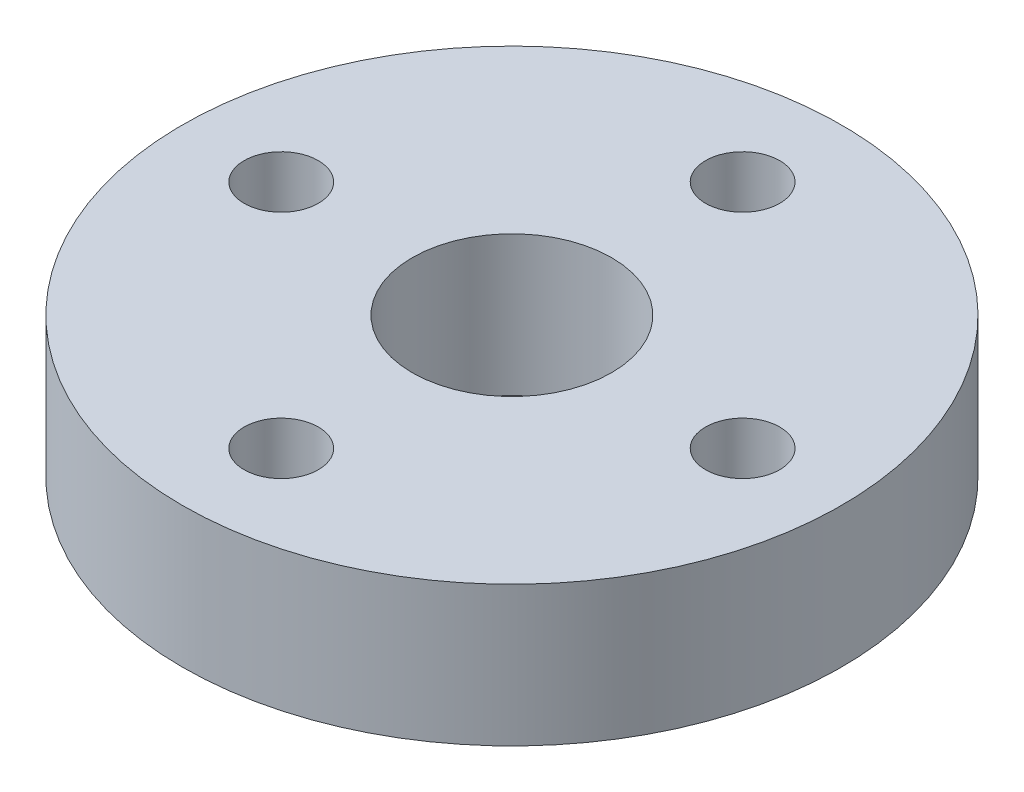
ISO-10303-21;
HEADER;
FILE_DESCRIPTION(('STEP AP214'),'2;1');
FILE_NAME('part.step','',(''),(''),'','','');
FILE_SCHEMA(('AUTOMOTIVE_DESIGN { 1 0 10303 214 1 1 1 1 }'));
ENDSEC;
DATA;
#1=APPLICATION_CONTEXT('core data for automotive mechanical design processes');
#2=APPLICATION_PROTOCOL_DEFINITION('international standard','automotive_design',2000,#1);
#3=PRODUCT_CONTEXT('',#1,'mechanical');
#4=PRODUCT('Part','Part','',(#3));
#5=PRODUCT_RELATED_PRODUCT_CATEGORY('part','',(#4));
#6=PRODUCT_DEFINITION_FORMATION('','',#4);
#7=PRODUCT_DEFINITION_CONTEXT('part definition',#1,'design');
#8=PRODUCT_DEFINITION('design','',#6,#7);
#9=PRODUCT_DEFINITION_SHAPE('','',#8);
#10=(LENGTH_UNIT() NAMED_UNIT(*) SI_UNIT(.MILLI.,.METRE.));
#11=(NAMED_UNIT(*) PLANE_ANGLE_UNIT() SI_UNIT($,.RADIAN.));
#12=(NAMED_UNIT(*) SI_UNIT($,.STERADIAN.) SOLID_ANGLE_UNIT());
#13=UNCERTAINTY_MEASURE_WITH_UNIT(LENGTH_MEASURE(1.E-05),#10,'distance_accuracy_value','');
#14=(GEOMETRIC_REPRESENTATION_CONTEXT(3) GLOBAL_UNCERTAINTY_ASSIGNED_CONTEXT((#13)) GLOBAL_UNIT_ASSIGNED_CONTEXT((#10,
#11,#12)) REPRESENTATION_CONTEXT('',''));
#15=CARTESIAN_POINT('',(0.,0.,0.));
#16=DIRECTION('',(0.,0.,1.));
#17=DIRECTION('',(1.,0.,0.));
#18=AXIS2_PLACEMENT_3D('',#15,#16,#17);
#19=CARTESIAN_POINT('',(0.,0.,0.));
#20=DIRECTION('',(0.,1.,0.));
#21=DIRECTION('',(0.,0.,1.));
#22=AXIS2_PLACEMENT_3D('',#19,#20,#21);
#23=PLANE('',#22);
#24=CARTESIAN_POINT('',(0.,0.,-7.));
#25=DIRECTION('',(0.,-1.,0.));
#26=DIRECTION('',(0.,0.,-1.));
#27=AXIS2_PLACEMENT_3D('',#24,#25,#26);
#28=CIRCLE('',#27,1.125);
#29=CARTESIAN_POINT('',(0.,0.,-8.125));
#30=VERTEX_POINT('',#29);
#31=EDGE_CURVE('E217',#30,#30,#28,.T.);
#32=ORIENTED_EDGE('',*,*,#31,.F.);
#33=EDGE_LOOP('',(#32));
#34=FACE_BOUND('',#33,.T.);
#35=CARTESIAN_POINT('',(7.,0.,0.));
#36=DIRECTION('',(0.,-1.,0.));
#37=DIRECTION('',(0.,0.,-1.));
#38=AXIS2_PLACEMENT_3D('',#35,#36,#37);
#39=CIRCLE('',#38,1.125);
#40=CARTESIAN_POINT('',(7.,0.,-1.125));
#41=VERTEX_POINT('',#40);
#42=EDGE_CURVE('E214',#41,#41,#39,.T.);
#43=ORIENTED_EDGE('',*,*,#42,.F.);
#44=EDGE_LOOP('',(#43));
#45=FACE_BOUND('',#44,.T.);
#46=CARTESIAN_POINT('',(-7.,0.,0.));
#47=DIRECTION('',(0.,-1.,0.));
#48=DIRECTION('',(0.,0.,-1.));
#49=AXIS2_PLACEMENT_3D('',#46,#47,#48);
#50=CIRCLE('',#49,1.125);
#51=CARTESIAN_POINT('',(-7.,0.,-1.125));
#52=VERTEX_POINT('',#51);
#53=EDGE_CURVE('E221',#52,#52,#50,.T.);
#54=ORIENTED_EDGE('',*,*,#53,.F.);
#55=EDGE_LOOP('',(#54));
#56=FACE_BOUND('',#55,.T.);
#57=CARTESIAN_POINT('',(0.,0.,7.));
#58=DIRECTION('',(0.,-1.,0.));
#59=DIRECTION('',(0.,0.,-1.));
#60=AXIS2_PLACEMENT_3D('',#57,#58,#59);
#61=CIRCLE('',#60,1.125);
#62=CARTESIAN_POINT('',(0.,0.,5.875));
#63=VERTEX_POINT('',#62);
#64=EDGE_CURVE('E225',#63,#63,#61,.T.);
#65=ORIENTED_EDGE('',*,*,#64,.F.);
#66=EDGE_LOOP('',(#65));
#67=FACE_BOUND('',#66,.T.);
#68=CARTESIAN_POINT('',(0.,0.,0.));
#69=DIRECTION('',(0.,1.,0.));
#70=DIRECTION('',(0.,0.,1.));
#71=AXIS2_PLACEMENT_3D('',#68,#69,#70);
#72=CIRCLE('',#71,10.);
#73=CARTESIAN_POINT('',(0.,0.,10.));
#74=VERTEX_POINT('',#73);
#75=EDGE_CURVE('E51',#74,#74,#72,.T.);
#76=ORIENTED_EDGE('',*,*,#75,.F.);
#77=EDGE_LOOP('',(#76));
#78=FACE_BOUND('',#77,.T.);
#79=CARTESIAN_POINT('',(-7.,0.,0.));
#80=DIRECTION('',(0.,1.,0.));
#81=DIRECTION('',(0.,0.,1.));
#82=AXIS2_PLACEMENT_3D('',#79,#80,#81);
#83=CIRCLE('',#82,2.125);
#84=CARTESIAN_POINT('',(-8.96316964285714,0.,-0.813381800487421));
#85=VERTEX_POINT('',#84);
#86=CARTESIAN_POINT('',(-8.96316964285714,0.,0.813381800487423));
#87=VERTEX_POINT('',#86);
#88=EDGE_CURVE('E191',#85,#87,#83,.F.);
#89=ORIENTED_EDGE('',*,*,#88,.T.);
#90=CARTESIAN_POINT('',(0.,0.,0.));
#91=DIRECTION('',(0.,1.,0.));
#92=DIRECTION('',(0.,0.,1.));
#93=AXIS2_PLACEMENT_3D('',#90,#91,#92);
#94=CIRCLE('',#93,9.);
#95=CARTESIAN_POINT('',(-0.813381800487432,0.,8.96316964285714));
#96=VERTEX_POINT('',#95);
#97=EDGE_CURVE('E160',#87,#96,#94,.T.);
#98=ORIENTED_EDGE('',*,*,#97,.T.);
#99=CARTESIAN_POINT('',(0.,0.,7.));
#100=DIRECTION('',(0.,1.,0.));
#101=DIRECTION('',(0.,0.,1.));
#102=AXIS2_PLACEMENT_3D('',#99,#100,#101);
#103=CIRCLE('',#102,2.125);
#104=CARTESIAN_POINT('',(0.813381800487438,0.,8.96316964285714));
#105=VERTEX_POINT('',#104);
#106=EDGE_CURVE('E194',#96,#105,#103,.F.);
#107=ORIENTED_EDGE('',*,*,#106,.T.);
#108=CARTESIAN_POINT('',(8.96316964285714,0.,0.813381800487423));
#109=VERTEX_POINT('',#108);
#110=EDGE_CURVE('E63',#105,#109,#94,.T.);
#111=ORIENTED_EDGE('',*,*,#110,.T.);
#112=CARTESIAN_POINT('',(7.,0.,0.));
#113=DIRECTION('',(0.,1.,0.));
#114=DIRECTION('',(0.,0.,1.));
#115=AXIS2_PLACEMENT_3D('',#112,#113,#114);
#116=CIRCLE('',#115,2.125);
#117=CARTESIAN_POINT('',(8.96316964285714,0.,-0.813381800487427));
#118=VERTEX_POINT('',#117);
#119=EDGE_CURVE('E196',#109,#118,#116,.F.);
#120=ORIENTED_EDGE('',*,*,#119,.T.);
#121=CARTESIAN_POINT('',(0.813381800487421,0.,-8.96316964285714));
#122=VERTEX_POINT('',#121);
#123=EDGE_CURVE('E164',#118,#122,#94,.T.);
#124=ORIENTED_EDGE('',*,*,#123,.T.);
#125=CARTESIAN_POINT('',(0.,0.,-7.));
#126=DIRECTION('',(0.,1.,0.));
#127=DIRECTION('',(0.,0.,1.));
#128=AXIS2_PLACEMENT_3D('',#125,#126,#127);
#129=CIRCLE('',#128,2.125);
#130=CARTESIAN_POINT('',(-0.813381800487424,0.,-8.96316964285714));
#131=VERTEX_POINT('',#130);
#132=EDGE_CURVE('E195',#122,#131,#129,.F.);
#133=ORIENTED_EDGE('',*,*,#132,.T.);
#134=EDGE_CURVE('E120',#131,#85,#94,.T.);
#135=ORIENTED_EDGE('',*,*,#134,.T.);
#136=EDGE_LOOP('',(#89,#98,#107,#111,#120,#124,#133,#135));
#137=FACE_BOUND('',#136,.T.);
#138=ADVANCED_FACE('F47',(#34,#45,#56,#67,#78,#137),#23,.F.);
#139=CARTESIAN_POINT('',(0.,4.25,0.));
#140=DIRECTION('',(0.,1.,0.));
#141=DIRECTION('',(0.,0.,1.));
#142=AXIS2_PLACEMENT_3D('',#139,#140,#141);
#143=PLANE('',#142);
#144=CARTESIAN_POINT('',(0.,4.25,-7.));
#145=DIRECTION('',(0.,-1.,0.));
#146=DIRECTION('',(0.,0.,-1.));
#147=AXIS2_PLACEMENT_3D('',#144,#145,#146);
#148=CIRCLE('',#147,1.125);
#149=CARTESIAN_POINT('',(0.,4.25,-8.125));
#150=VERTEX_POINT('',#149);
#151=EDGE_CURVE('E230',#150,#150,#148,.T.);
#152=ORIENTED_EDGE('',*,*,#151,.T.);
#153=EDGE_LOOP('',(#152));
#154=FACE_BOUND('',#153,.T.);
#155=CARTESIAN_POINT('',(0.,4.25,7.));
#156=DIRECTION('',(0.,-1.,0.));
#157=DIRECTION('',(0.,0.,-1.));
#158=AXIS2_PLACEMENT_3D('',#155,#156,#157);
#159=CIRCLE('',#158,1.125);
#160=CARTESIAN_POINT('',(0.,4.25,5.875));
#161=VERTEX_POINT('',#160);
#162=EDGE_CURVE('E235',#161,#161,#159,.T.);
#163=ORIENTED_EDGE('',*,*,#162,.T.);
#164=EDGE_LOOP('',(#163));
#165=FACE_BOUND('',#164,.T.);
#166=CARTESIAN_POINT('',(7.,4.25,0.));
#167=DIRECTION('',(0.,-1.,0.));
#168=DIRECTION('',(0.,0.,-1.));
#169=AXIS2_PLACEMENT_3D('',#166,#167,#168);
#170=CIRCLE('',#169,1.125);
#171=CARTESIAN_POINT('',(7.,4.25,-1.125));
#172=VERTEX_POINT('',#171);
#173=EDGE_CURVE('E238',#172,#172,#170,.T.);
#174=ORIENTED_EDGE('',*,*,#173,.T.);
#175=EDGE_LOOP('',(#174));
#176=FACE_BOUND('',#175,.T.);
#177=CARTESIAN_POINT('',(-7.,4.25,0.));
#178=DIRECTION('',(0.,-1.,0.));
#179=DIRECTION('',(0.,0.,-1.));
#180=AXIS2_PLACEMENT_3D('',#177,#178,#179);
#181=CIRCLE('',#180,1.125);
#182=CARTESIAN_POINT('',(-7.,4.25,-1.125));
#183=VERTEX_POINT('',#182);
#184=EDGE_CURVE('E229',#183,#183,#181,.T.);
#185=ORIENTED_EDGE('',*,*,#184,.T.);
#186=EDGE_LOOP('',(#185));
#187=FACE_BOUND('',#186,.T.);
#188=CARTESIAN_POINT('',(0.,4.25,0.));
#189=DIRECTION('',(0.,1.,0.));
#190=DIRECTION('',(0.,0.,1.));
#191=AXIS2_PLACEMENT_3D('',#188,#189,#190);
#192=CIRCLE('',#191,10.);
#193=CARTESIAN_POINT('',(0.,4.25,10.));
#194=VERTEX_POINT('',#193);
#195=EDGE_CURVE('E11',#194,#194,#192,.T.);
#196=ORIENTED_EDGE('',*,*,#195,.T.);
#197=EDGE_LOOP('',(#196));
#198=FACE_BOUND('',#197,.T.);
#199=CARTESIAN_POINT('',(0.,4.25,0.));
#200=DIRECTION('',(0.,1.,0.));
#201=DIRECTION('',(0.,0.,1.));
#202=AXIS2_PLACEMENT_3D('',#199,#200,#201);
#203=CIRCLE('',#202,3.025);
#204=CARTESIAN_POINT('',(0.,4.25,3.025));
#205=VERTEX_POINT('',#204);
#206=EDGE_CURVE('E244',#205,#205,#203,.T.);
#207=ORIENTED_EDGE('',*,*,#206,.F.);
#208=EDGE_LOOP('',(#207));
#209=FACE_BOUND('',#208,.T.);
#210=ADVANCED_FACE('F268',(#154,#165,#176,#187,#198,#209),#143,.T.);
#211=CARTESIAN_POINT('',(0.,0.,0.));
#212=DIRECTION('',(0.,1.,0.));
#213=DIRECTION('',(0.,0.,1.));
#214=AXIS2_PLACEMENT_3D('',#211,#212,#213);
#215=CIRCLE('',#214,4.025);
#216=CARTESIAN_POINT('',(0.,0.,4.025));
#217=VERTEX_POINT('',#216);
#218=EDGE_CURVE('E132',#217,#217,#215,.T.);
#219=ORIENTED_EDGE('',*,*,#218,.F.);
#220=EDGE_LOOP('',(#219));
#221=FACE_BOUND('',#220,.T.);
#222=CARTESIAN_POINT('',(0.,0.,0.));
#223=DIRECTION('',(0.,1.,0.));
#224=DIRECTION('',(0.,0.,1.));
#225=AXIS2_PLACEMENT_3D('',#222,#223,#224);
#226=CIRCLE('',#225,3.025);
#227=CARTESIAN_POINT('',(0.,0.,3.025));
#228=VERTEX_POINT('',#227);
#229=EDGE_CURVE('E234',#228,#228,#226,.T.);
#230=ORIENTED_EDGE('',*,*,#229,.T.);
#231=EDGE_LOOP('',(#230));
#232=FACE_BOUND('',#231,.T.);
#233=ADVANCED_FACE('F252',(#221,#232),#23,.F.);
#234=CARTESIAN_POINT('',(0.,4.25,0.));
#235=DIRECTION('',(0.,-1.,0.));
#236=DIRECTION('',(0.,0.,-1.));
#237=AXIS2_PLACEMENT_3D('',#234,#235,#236);
#238=CYLINDRICAL_SURFACE('',#237,10.);
#239=ORIENTED_EDGE('',*,*,#195,.F.);
#240=EDGE_LOOP('',(#239));
#241=FACE_BOUND('',#240,.T.);
#242=ORIENTED_EDGE('',*,*,#75,.T.);
#243=EDGE_LOOP('',(#242));
#244=FACE_BOUND('',#243,.T.);
#245=ADVANCED_FACE('F49',(#241,#244),#238,.T.);
#246=CARTESIAN_POINT('',(0.,4.25,0.));
#247=DIRECTION('',(0.,-1.,0.));
#248=DIRECTION('',(0.,0.,-1.));
#249=AXIS2_PLACEMENT_3D('',#246,#247,#248);
#250=CYLINDRICAL_SURFACE('',#249,3.025);
#251=ORIENTED_EDGE('',*,*,#206,.T.);
#252=EDGE_LOOP('',(#251));
#253=FACE_BOUND('',#252,.T.);
#254=ORIENTED_EDGE('',*,*,#229,.F.);
#255=EDGE_LOOP('',(#254));
#256=FACE_BOUND('',#255,.T.);
#257=ADVANCED_FACE('F254',(#253,#256),#250,.F.);
#258=CARTESIAN_POINT('',(-7.,4.25,0.));
#259=DIRECTION('',(0.,-1.,0.));
#260=DIRECTION('',(0.,0.,-1.));
#261=AXIS2_PLACEMENT_3D('',#258,#259,#260);
#262=CYLINDRICAL_SURFACE('',#261,1.125);
#263=ORIENTED_EDGE('',*,*,#184,.F.);
#264=EDGE_LOOP('',(#263));
#265=FACE_BOUND('',#264,.T.);
#266=ORIENTED_EDGE('',*,*,#53,.T.);
#267=EDGE_LOOP('',(#266));
#268=FACE_BOUND('',#267,.T.);
#269=ADVANCED_FACE('F256',(#265,#268),#262,.F.);
#270=CARTESIAN_POINT('',(7.,4.25,0.));
#271=DIRECTION('',(0.,-1.,0.));
#272=DIRECTION('',(0.,0.,-1.));
#273=AXIS2_PLACEMENT_3D('',#270,#271,#272);
#274=CYLINDRICAL_SURFACE('',#273,1.125);
#275=ORIENTED_EDGE('',*,*,#173,.F.);
#276=EDGE_LOOP('',(#275));
#277=FACE_BOUND('',#276,.T.);
#278=ORIENTED_EDGE('',*,*,#42,.T.);
#279=EDGE_LOOP('',(#278));
#280=FACE_BOUND('',#279,.T.);
#281=ADVANCED_FACE('F262',(#277,#280),#274,.F.);
#282=CARTESIAN_POINT('',(0.,4.25,7.));
#283=DIRECTION('',(0.,-1.,0.));
#284=DIRECTION('',(0.,0.,-1.));
#285=AXIS2_PLACEMENT_3D('',#282,#283,#284);
#286=CYLINDRICAL_SURFACE('',#285,1.125);
#287=ORIENTED_EDGE('',*,*,#162,.F.);
#288=EDGE_LOOP('',(#287));
#289=FACE_BOUND('',#288,.T.);
#290=ORIENTED_EDGE('',*,*,#64,.T.);
#291=EDGE_LOOP('',(#290));
#292=FACE_BOUND('',#291,.T.);
#293=ADVANCED_FACE('F310',(#289,#292),#286,.F.);
#294=CARTESIAN_POINT('',(0.,4.25,-7.));
#295=DIRECTION('',(0.,-1.,0.));
#296=DIRECTION('',(0.,0.,-1.));
#297=AXIS2_PLACEMENT_3D('',#294,#295,#296);
#298=CYLINDRICAL_SURFACE('',#297,1.125);
#299=ORIENTED_EDGE('',*,*,#151,.F.);
#300=EDGE_LOOP('',(#299));
#301=FACE_BOUND('',#300,.T.);
#302=ORIENTED_EDGE('',*,*,#31,.T.);
#303=EDGE_LOOP('',(#302));
#304=FACE_BOUND('',#303,.T.);
#305=ADVANCED_FACE('F320',(#301,#304),#298,.F.);
#306=CARTESIAN_POINT('',(0.,4.25,0.));
#307=DIRECTION('',(0.,-1.,0.));
#308=DIRECTION('',(0.,0.,-1.));
#309=AXIS2_PLACEMENT_3D('',#306,#307,#308);
#310=CYLINDRICAL_SURFACE('',#309,9.);
#311=ORIENTED_EDGE('',*,*,#97,.F.);
#312=DIRECTION('',(0.,-1.,0.));
#313=VECTOR('',#312,1.);
#314=CARTESIAN_POINT('',(-8.96316964285714,4.25,0.813381800487423));
#315=LINE('',#314,#313);
#316=CARTESIAN_POINT('',(-8.96316964285714,3.25,0.813381800487423));
#317=VERTEX_POINT('',#316);
#318=EDGE_CURVE('E207',#87,#317,#315,.F.);
#319=ORIENTED_EDGE('',*,*,#318,.T.);
#320=CARTESIAN_POINT('',(0.,3.25,0.));
#321=DIRECTION('',(0.,1.,0.));
#322=DIRECTION('',(0.,0.,1.));
#323=AXIS2_PLACEMENT_3D('',#320,#321,#322);
#324=CIRCLE('',#323,9.);
#325=CARTESIAN_POINT('',(-0.81338180048742,3.25,8.96316964285714));
#326=VERTEX_POINT('',#325);
#327=EDGE_CURVE('E142',#317,#326,#324,.T.);
#328=ORIENTED_EDGE('',*,*,#327,.T.);
#329=DIRECTION('',(0.,-1.,0.));
#330=VECTOR('',#329,1.);
#331=CARTESIAN_POINT('',(-0.813381800487432,4.25,8.96316964285714));
#332=LINE('',#331,#330);
#333=EDGE_CURVE('E212',#96,#326,#332,.F.);
#334=ORIENTED_EDGE('',*,*,#333,.F.);
#335=EDGE_LOOP('',(#311,#319,#328,#334));
#336=FACE_BOUND('',#335,.T.);
#337=ADVANCED_FACE('F329',(#336),#310,.F.);
#338=DIRECTION('',(0.,-1.,0.));
#339=VECTOR('',#338,1.);
#340=CARTESIAN_POINT('',(0.813381800487425,4.25,8.96316964285714));
#341=LINE('',#340,#339);
#342=CARTESIAN_POINT('',(0.813381800487425,3.25,8.96316964285714));
#343=VERTEX_POINT('',#342);
#344=EDGE_CURVE('E210',#105,#343,#341,.F.);
#345=ORIENTED_EDGE('',*,*,#344,.T.);
#346=CARTESIAN_POINT('',(8.96316964285714,3.25,0.813381800487423));
#347=VERTEX_POINT('',#346);
#348=EDGE_CURVE('E144',#343,#347,#324,.T.);
#349=ORIENTED_EDGE('',*,*,#348,.T.);
#350=DIRECTION('',(0.,-1.,0.));
#351=VECTOR('',#350,1.);
#352=CARTESIAN_POINT('',(8.96316964285714,4.25,0.813381800487433));
#353=LINE('',#352,#351);
#354=EDGE_CURVE('E124',#109,#347,#353,.F.);
#355=ORIENTED_EDGE('',*,*,#354,.F.);
#356=ORIENTED_EDGE('',*,*,#110,.F.);
#357=EDGE_LOOP('',(#345,#349,#355,#356));
#358=FACE_BOUND('',#357,.T.);
#359=ADVANCED_FACE('F351',(#358),#310,.F.);
#360=DIRECTION('',(0.,-1.,0.));
#361=VECTOR('',#360,1.);
#362=CARTESIAN_POINT('',(8.96316964285714,4.25,-0.813381800487427));
#363=LINE('',#362,#361);
#364=CARTESIAN_POINT('',(8.96316964285714,3.25,-0.813381800487427));
#365=VERTEX_POINT('',#364);
#366=EDGE_CURVE('E202',#118,#365,#363,.F.);
#367=ORIENTED_EDGE('',*,*,#366,.T.);
#368=CARTESIAN_POINT('',(0.813381800487421,3.25,-8.96316964285714));
#369=VERTEX_POINT('',#368);
#370=EDGE_CURVE('E151',#365,#369,#324,.T.);
#371=ORIENTED_EDGE('',*,*,#370,.T.);
#372=DIRECTION('',(0.,-1.,0.));
#373=VECTOR('',#372,1.);
#374=CARTESIAN_POINT('',(0.813381800487434,4.25,-8.96316964285714));
#375=LINE('',#374,#373);
#376=EDGE_CURVE('E71',#122,#369,#375,.F.);
#377=ORIENTED_EDGE('',*,*,#376,.F.);
#378=ORIENTED_EDGE('',*,*,#123,.F.);
#379=EDGE_LOOP('',(#367,#371,#377,#378));
#380=FACE_BOUND('',#379,.T.);
#381=ADVANCED_FACE('F361',(#380),#310,.F.);
#382=CARTESIAN_POINT('',(0.,3.25,0.));
#383=DIRECTION('',(0.,1.,0.));
#384=DIRECTION('',(0.,0.,1.));
#385=AXIS2_PLACEMENT_3D('',#382,#383,#384);
#386=PLANE('',#385);
#387=CARTESIAN_POINT('',(-0.813381800487424,3.25,-8.96316964285714));
#388=VERTEX_POINT('',#387);
#389=CARTESIAN_POINT('',(-8.96316964285714,3.25,-0.813381800487421));
#390=VERTEX_POINT('',#389);
#391=EDGE_CURVE('E118',#388,#390,#324,.T.);
#392=ORIENTED_EDGE('',*,*,#391,.F.);
#393=CARTESIAN_POINT('',(0.,3.25,-7.));
#394=DIRECTION('',(0.,1.,0.));
#395=DIRECTION('',(0.,0.,1.));
#396=AXIS2_PLACEMENT_3D('',#393,#394,#395);
#397=CIRCLE('',#396,2.125);
#398=EDGE_CURVE('E127',#369,#388,#397,.F.);
#399=ORIENTED_EDGE('',*,*,#398,.F.);
#400=ORIENTED_EDGE('',*,*,#370,.F.);
#401=CARTESIAN_POINT('',(7.,3.25,0.));
#402=DIRECTION('',(0.,1.,0.));
#403=DIRECTION('',(0.,0.,1.));
#404=AXIS2_PLACEMENT_3D('',#401,#402,#403);
#405=CIRCLE('',#404,2.125);
#406=EDGE_CURVE('E458',#347,#365,#405,.F.);
#407=ORIENTED_EDGE('',*,*,#406,.F.);
#408=ORIENTED_EDGE('',*,*,#348,.F.);
#409=CARTESIAN_POINT('',(0.,3.25,7.));
#410=DIRECTION('',(0.,1.,0.));
#411=DIRECTION('',(0.,0.,1.));
#412=AXIS2_PLACEMENT_3D('',#409,#410,#411);
#413=CIRCLE('',#412,2.125);
#414=EDGE_CURVE('E133',#326,#343,#413,.F.);
#415=ORIENTED_EDGE('',*,*,#414,.F.);
#416=ORIENTED_EDGE('',*,*,#327,.F.);
#417=CARTESIAN_POINT('',(-7.,3.25,0.));
#418=DIRECTION('',(0.,1.,0.));
#419=DIRECTION('',(0.,0.,1.));
#420=AXIS2_PLACEMENT_3D('',#417,#418,#419);
#421=CIRCLE('',#420,2.125);
#422=EDGE_CURVE('E140',#390,#317,#421,.F.);
#423=ORIENTED_EDGE('',*,*,#422,.F.);
#424=EDGE_LOOP('',(#392,#399,#400,#407,#408,#415,#416,#423));
#425=FACE_BOUND('',#424,.T.);
#426=CARTESIAN_POINT('',(0.,3.25,0.));
#427=DIRECTION('',(0.,1.,0.));
#428=DIRECTION('',(0.,0.,1.));
#429=AXIS2_PLACEMENT_3D('',#426,#427,#428);
#430=CIRCLE('',#429,4.025);
#431=CARTESIAN_POINT('',(0.,3.25,4.025));
#432=VERTEX_POINT('',#431);
#433=EDGE_CURVE('E177',#432,#432,#430,.T.);
#434=ORIENTED_EDGE('',*,*,#433,.T.);
#435=EDGE_LOOP('',(#434));
#436=FACE_BOUND('',#435,.T.);
#437=ADVANCED_FACE('F136',(#425,#436),#386,.F.);
#438=ORIENTED_EDGE('',*,*,#134,.F.);
#439=DIRECTION('',(0.,-1.,0.));
#440=VECTOR('',#439,1.);
#441=CARTESIAN_POINT('',(-0.813381800487424,4.25,-8.96316964285714));
#442=LINE('',#441,#440);
#443=EDGE_CURVE('E114',#131,#388,#442,.F.);
#444=ORIENTED_EDGE('',*,*,#443,.T.);
#445=ORIENTED_EDGE('',*,*,#391,.T.);
#446=DIRECTION('',(0.,-1.,0.));
#447=VECTOR('',#446,1.);
#448=CARTESIAN_POINT('',(-8.96316964285714,4.25,-0.813381800487434));
#449=LINE('',#448,#447);
#450=EDGE_CURVE('E204',#85,#390,#449,.F.);
#451=ORIENTED_EDGE('',*,*,#450,.F.);
#452=EDGE_LOOP('',(#438,#444,#445,#451));
#453=FACE_BOUND('',#452,.T.);
#454=ADVANCED_FACE('F116',(#453),#310,.F.);
#455=CARTESIAN_POINT('',(0.,4.25,0.));
#456=DIRECTION('',(0.,-1.,0.));
#457=DIRECTION('',(0.,0.,-1.));
#458=AXIS2_PLACEMENT_3D('',#455,#456,#457);
#459=CYLINDRICAL_SURFACE('',#458,4.025);
#460=ORIENTED_EDGE('',*,*,#433,.F.);
#461=EDGE_LOOP('',(#460));
#462=FACE_BOUND('',#461,.T.);
#463=ORIENTED_EDGE('',*,*,#218,.T.);
#464=EDGE_LOOP('',(#463));
#465=FACE_BOUND('',#464,.T.);
#466=ADVANCED_FACE('F383',(#462,#465),#459,.T.);
#467=CARTESIAN_POINT('',(-7.,4.25,0.));
#468=DIRECTION('',(0.,-1.,0.));
#469=DIRECTION('',(0.,0.,-1.));
#470=AXIS2_PLACEMENT_3D('',#467,#468,#469);
#471=CYLINDRICAL_SURFACE('',#470,2.125);
#472=ORIENTED_EDGE('',*,*,#88,.F.);
#473=ORIENTED_EDGE('',*,*,#450,.T.);
#474=ORIENTED_EDGE('',*,*,#422,.T.);
#475=ORIENTED_EDGE('',*,*,#318,.F.);
#476=EDGE_LOOP('',(#472,#473,#474,#475));
#477=FACE_BOUND('',#476,.T.);
#478=ADVANCED_FACE('F390',(#477),#471,.T.);
#479=CARTESIAN_POINT('',(7.,4.25,0.));
#480=DIRECTION('',(0.,-1.,0.));
#481=DIRECTION('',(0.,0.,-1.));
#482=AXIS2_PLACEMENT_3D('',#479,#480,#481);
#483=CYLINDRICAL_SURFACE('',#482,2.125);
#484=ORIENTED_EDGE('',*,*,#119,.F.);
#485=ORIENTED_EDGE('',*,*,#354,.T.);
#486=ORIENTED_EDGE('',*,*,#406,.T.);
#487=ORIENTED_EDGE('',*,*,#366,.F.);
#488=EDGE_LOOP('',(#484,#485,#486,#487));
#489=FACE_BOUND('',#488,.T.);
#490=ADVANCED_FACE('F400',(#489),#483,.T.);
#491=CARTESIAN_POINT('',(0.,4.25,7.));
#492=DIRECTION('',(0.,-1.,0.));
#493=DIRECTION('',(0.,0.,-1.));
#494=AXIS2_PLACEMENT_3D('',#491,#492,#493);
#495=CYLINDRICAL_SURFACE('',#494,2.125);
#496=ORIENTED_EDGE('',*,*,#333,.T.);
#497=ORIENTED_EDGE('',*,*,#414,.T.);
#498=ORIENTED_EDGE('',*,*,#344,.F.);
#499=ORIENTED_EDGE('',*,*,#106,.F.);
#500=EDGE_LOOP('',(#496,#497,#498,#499));
#501=FACE_BOUND('',#500,.T.);
#502=ADVANCED_FACE('F410',(#501),#495,.T.);
#503=CARTESIAN_POINT('',(0.,4.25,-7.));
#504=DIRECTION('',(0.,-1.,0.));
#505=DIRECTION('',(0.,0.,-1.));
#506=AXIS2_PLACEMENT_3D('',#503,#504,#505);
#507=CYLINDRICAL_SURFACE('',#506,2.125);
#508=ORIENTED_EDGE('',*,*,#132,.F.);
#509=ORIENTED_EDGE('',*,*,#376,.T.);
#510=ORIENTED_EDGE('',*,*,#398,.T.);
#511=ORIENTED_EDGE('',*,*,#443,.F.);
#512=EDGE_LOOP('',(#508,#509,#510,#511));
#513=FACE_BOUND('',#512,.T.);
#514=ADVANCED_FACE('F128',(#513),#507,.T.);
#515=CLOSED_SHELL('',(#138,#210,#233,#245,#257,#269,#281,#293,#305,#337,#359,#381,#437,#454,
#466,#478,#490,#502,#514));
#516=MANIFOLD_SOLID_BREP('B2',#515);
#517=ADVANCED_BREP_SHAPE_REPRESENTATION('',(#18,#516),#14);
#518=SHAPE_DEFINITION_REPRESENTATION(#9,#517);
ENDSEC;
END-ISO-10303-21;
